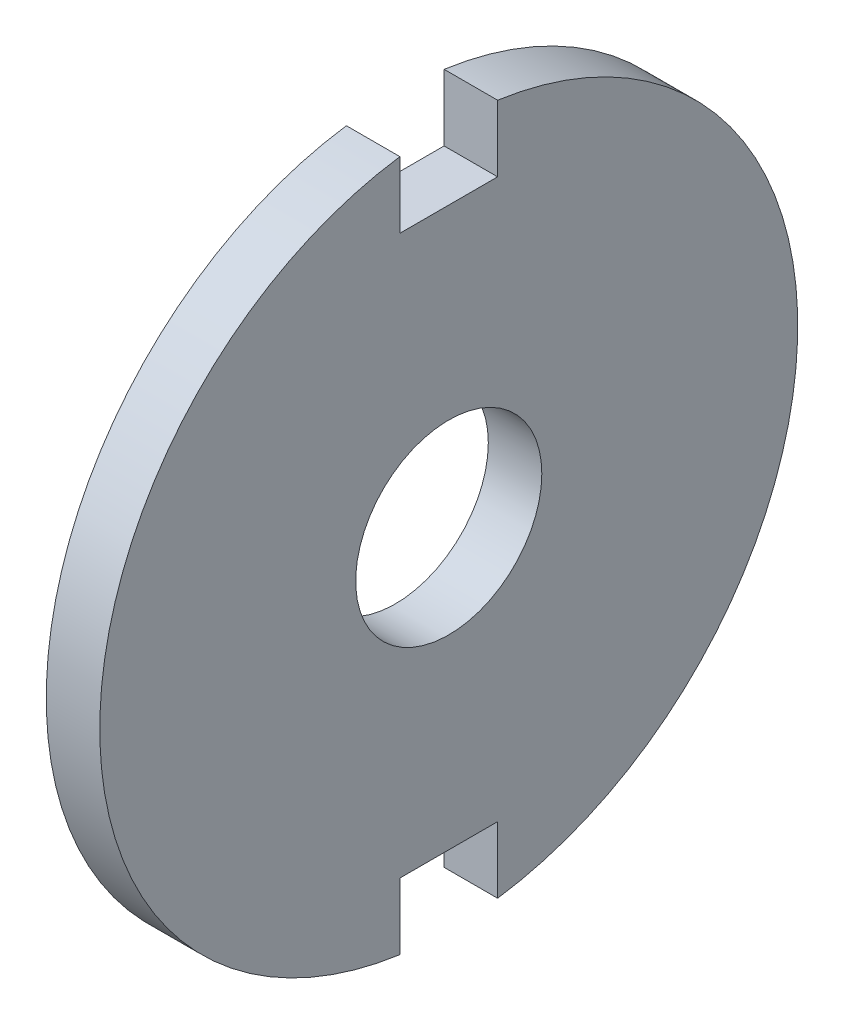
ISO-10303-21;
HEADER;
FILE_DESCRIPTION(('STEP AP214'),'2;1');
FILE_NAME('part.step','',(''),(''),'','','');
FILE_SCHEMA(('AUTOMOTIVE_DESIGN { 1 0 10303 214 1 1 1 1 }'));
ENDSEC;
DATA;
#1=APPLICATION_CONTEXT('core data for automotive mechanical design processes');
#2=APPLICATION_PROTOCOL_DEFINITION('international standard','automotive_design',2000,#1);
#3=PRODUCT_CONTEXT('',#1,'mechanical');
#4=PRODUCT('Part','Part','',(#3));
#5=PRODUCT_RELATED_PRODUCT_CATEGORY('part','',(#4));
#6=PRODUCT_DEFINITION_FORMATION('','',#4);
#7=PRODUCT_DEFINITION_CONTEXT('part definition',#1,'design');
#8=PRODUCT_DEFINITION('design','',#6,#7);
#9=PRODUCT_DEFINITION_SHAPE('','',#8);
#10=(LENGTH_UNIT() NAMED_UNIT(*) SI_UNIT(.MILLI.,.METRE.));
#11=(NAMED_UNIT(*) PLANE_ANGLE_UNIT() SI_UNIT($,.RADIAN.));
#12=(NAMED_UNIT(*) SI_UNIT($,.STERADIAN.) SOLID_ANGLE_UNIT());
#13=UNCERTAINTY_MEASURE_WITH_UNIT(LENGTH_MEASURE(1.E-05),#10,'distance_accuracy_value','');
#14=(GEOMETRIC_REPRESENTATION_CONTEXT(3) GLOBAL_UNCERTAINTY_ASSIGNED_CONTEXT((#13)) GLOBAL_UNIT_ASSIGNED_CONTEXT((#10,
#11,#12)) REPRESENTATION_CONTEXT('',''));
#15=CARTESIAN_POINT('',(0.,0.,0.));
#16=DIRECTION('',(0.,0.,1.));
#17=DIRECTION('',(1.,0.,0.));
#18=AXIS2_PLACEMENT_3D('',#15,#16,#17);
#19=CARTESIAN_POINT('',(123.45,0.,0.));
#20=DIRECTION('',(-1.,0.,0.));
#21=DIRECTION('',(0.,0.,1.));
#22=AXIS2_PLACEMENT_3D('',#19,#20,#21);
#23=CYLINDRICAL_SURFACE('',#22,4.);
#24=CARTESIAN_POINT('',(124.6,0.,0.));
#25=DIRECTION('',(-1.,0.,0.));
#26=DIRECTION('',(0.,0.,-1.));
#27=AXIS2_PLACEMENT_3D('',#24,#25,#26);
#28=CIRCLE('',#27,4.);
#29=CARTESIAN_POINT('',(124.6,0.,-4.));
#30=VERTEX_POINT('',#29);
#31=EDGE_CURVE('E42',#30,#30,#28,.T.);
#32=ORIENTED_EDGE('',*,*,#31,.F.);
#33=DIRECTION('',(-1.,0.,0.));
#34=VECTOR('',#33,1.);
#35=CARTESIAN_POINT('',(123.45,0.,-4.));
#36=LINE('',#35,#34);
#37=CARTESIAN_POINT('',(122.3,0.,-4.));
#38=VERTEX_POINT('',#37);
#39=EDGE_CURVE('E11',#30,#38,#36,.T.);
#40=ORIENTED_EDGE('',*,*,#39,.T.);
#41=CARTESIAN_POINT('',(122.3,0.,0.));
#42=DIRECTION('',(1.,0.,0.));
#43=DIRECTION('',(0.,0.,-1.));
#44=AXIS2_PLACEMENT_3D('',#41,#42,#43);
#45=CIRCLE('',#44,4.);
#46=EDGE_CURVE('E208',#38,#38,#45,.T.);
#47=ORIENTED_EDGE('',*,*,#46,.F.);
#48=ORIENTED_EDGE('',*,*,#39,.F.);
#49=EDGE_LOOP('',(#32,#40,#47,#48));
#50=FACE_BOUND('',#49,.T.);
#51=ADVANCED_FACE('F18',(#50),#23,.F.);
#52=CARTESIAN_POINT('',(122.3,0.,9.5));
#53=DIRECTION('',(-1.,0.,0.));
#54=DIRECTION('',(0.,0.,1.));
#55=AXIS2_PLACEMENT_3D('',#52,#53,#54);
#56=PLANE('',#55);
#57=DIRECTION('',(0.,-1.,0.));
#58=VECTOR('',#57,1.);
#59=CARTESIAN_POINT('',(122.3,-12.,-2.1));
#60=LINE('',#59,#58);
#61=CARTESIAN_POINT('',(122.3,-12.,-2.1));
#62=VERTEX_POINT('',#61);
#63=CARTESIAN_POINT('',(122.3,-14.85227255338,-2.1));
#64=VERTEX_POINT('',#63);
#65=EDGE_CURVE('E99',#62,#64,#60,.T.);
#66=ORIENTED_EDGE('',*,*,#65,.F.);
#67=DIRECTION('',(0.,0.,-1.));
#68=VECTOR('',#67,1.);
#69=CARTESIAN_POINT('',(122.3,-12.,2.1));
#70=LINE('',#69,#68);
#71=CARTESIAN_POINT('',(122.3,-12.,2.1));
#72=VERTEX_POINT('',#71);
#73=EDGE_CURVE('E175',#72,#62,#70,.T.);
#74=ORIENTED_EDGE('',*,*,#73,.F.);
#75=DIRECTION('',(0.,1.,0.));
#76=VECTOR('',#75,1.);
#77=CARTESIAN_POINT('',(122.3,-14.85227255338,2.1));
#78=LINE('',#77,#76);
#79=CARTESIAN_POINT('',(122.3,-14.85227255338,2.1));
#80=VERTEX_POINT('',#79);
#81=EDGE_CURVE('E182',#80,#72,#78,.T.);
#82=ORIENTED_EDGE('',*,*,#81,.F.);
#83=CARTESIAN_POINT('',(122.3,0.,0.));
#84=DIRECTION('',(-1.,0.,0.));
#85=DIRECTION('',(0.,0.,1.));
#86=AXIS2_PLACEMENT_3D('',#83,#84,#85);
#87=CIRCLE('',#86,15.);
#88=CARTESIAN_POINT('',(122.3,14.85227255338,2.1));
#89=VERTEX_POINT('',#88);
#90=EDGE_CURVE('E29',#80,#89,#87,.T.);
#91=ORIENTED_EDGE('',*,*,#90,.T.);
#92=DIRECTION('',(0.,1.,0.));
#93=VECTOR('',#92,1.);
#94=CARTESIAN_POINT('',(122.3,12.,2.1));
#95=LINE('',#94,#93);
#96=CARTESIAN_POINT('',(122.3,12.,2.1));
#97=VERTEX_POINT('',#96);
#98=EDGE_CURVE('E165',#97,#89,#95,.T.);
#99=ORIENTED_EDGE('',*,*,#98,.F.);
#100=DIRECTION('',(0.,0.,1.));
#101=VECTOR('',#100,1.);
#102=CARTESIAN_POINT('',(122.3,12.,-2.1));
#103=LINE('',#102,#101);
#104=CARTESIAN_POINT('',(122.3,12.,-2.1));
#105=VERTEX_POINT('',#104);
#106=EDGE_CURVE('E162',#105,#97,#103,.T.);
#107=ORIENTED_EDGE('',*,*,#106,.F.);
#108=DIRECTION('',(0.,-1.,0.));
#109=VECTOR('',#108,1.);
#110=CARTESIAN_POINT('',(122.3,14.85227255338,-2.1));
#111=LINE('',#110,#109);
#112=CARTESIAN_POINT('',(122.3,14.85227255338,-2.1));
#113=VERTEX_POINT('',#112);
#114=EDGE_CURVE('E154',#113,#105,#111,.T.);
#115=ORIENTED_EDGE('',*,*,#114,.F.);
#116=CARTESIAN_POINT('',(122.3,0.,0.));
#117=DIRECTION('',(-1.,0.,0.));
#118=DIRECTION('',(0.,0.,-1.));
#119=AXIS2_PLACEMENT_3D('',#116,#117,#118);
#120=CIRCLE('',#119,15.);
#121=EDGE_CURVE('E137',#113,#64,#120,.T.);
#122=ORIENTED_EDGE('',*,*,#121,.T.);
#123=EDGE_LOOP('',(#66,#74,#82,#91,#99,#107,#115,#122));
#124=FACE_BOUND('',#123,.T.);
#125=ORIENTED_EDGE('',*,*,#46,.T.);
#126=EDGE_LOOP('',(#125));
#127=FACE_BOUND('',#126,.T.);
#128=ADVANCED_FACE('F227',(#124,#127),#56,.T.);
#129=CARTESIAN_POINT('',(123.45,-16.,-2.1));
#130=DIRECTION('',(0.,0.,-1.));
#131=DIRECTION('',(0.,-1.,0.));
#132=AXIS2_PLACEMENT_3D('',#129,#130,#131);
#133=PLANE('',#132);
#134=DIRECTION('',(-1.,0.,0.));
#135=VECTOR('',#134,1.);
#136=CARTESIAN_POINT('',(124.6,-14.85227255338,-2.1));
#137=LINE('',#136,#135);
#138=CARTESIAN_POINT('',(124.6,-14.85227255338,-2.1));
#139=VERTEX_POINT('',#138);
#140=EDGE_CURVE('E109',#139,#64,#137,.T.);
#141=ORIENTED_EDGE('',*,*,#140,.F.);
#142=DIRECTION('',(0.,1.,0.));
#143=VECTOR('',#142,1.);
#144=CARTESIAN_POINT('',(124.6,-14.85227255338,-2.1));
#145=LINE('',#144,#143);
#146=CARTESIAN_POINT('',(124.6,-12.,-2.1));
#147=VERTEX_POINT('',#146);
#148=EDGE_CURVE('E129',#139,#147,#145,.T.);
#149=ORIENTED_EDGE('',*,*,#148,.T.);
#150=DIRECTION('',(-1.,0.,0.));
#151=VECTOR('',#150,1.);
#152=CARTESIAN_POINT('',(124.6,-12.,-2.1));
#153=LINE('',#152,#151);
#154=EDGE_CURVE('E250',#147,#62,#153,.T.);
#155=ORIENTED_EDGE('',*,*,#154,.T.);
#156=ORIENTED_EDGE('',*,*,#65,.T.);
#157=EDGE_LOOP('',(#141,#149,#155,#156));
#158=FACE_BOUND('',#157,.T.);
#159=ADVANCED_FACE('F260',(#158),#133,.F.);
#160=CARTESIAN_POINT('',(123.45,0.,0.));
#161=DIRECTION('',(-1.,0.,0.));
#162=DIRECTION('',(0.,0.,-1.));
#163=AXIS2_PLACEMENT_3D('',#160,#161,#162);
#164=CYLINDRICAL_SURFACE('',#163,15.);
#165=CARTESIAN_POINT('',(124.6,0.,0.));
#166=DIRECTION('',(1.,0.,0.));
#167=DIRECTION('',(0.,-0.990151503558925,-0.140000000000003));
#168=AXIS2_PLACEMENT_3D('',#165,#166,#167);
#169=CIRCLE('',#168,15.);
#170=CARTESIAN_POINT('',(124.6,14.85227255338,-2.1));
#171=VERTEX_POINT('',#170);
#172=EDGE_CURVE('E120',#139,#171,#169,.T.);
#173=ORIENTED_EDGE('',*,*,#172,.F.);
#174=ORIENTED_EDGE('',*,*,#140,.T.);
#175=ORIENTED_EDGE('',*,*,#121,.F.);
#176=DIRECTION('',(1.,0.,0.));
#177=VECTOR('',#176,1.);
#178=CARTESIAN_POINT('',(122.3,14.85227255338,-2.1));
#179=LINE('',#178,#177);
#180=EDGE_CURVE('E132',#113,#171,#179,.T.);
#181=ORIENTED_EDGE('',*,*,#180,.T.);
#182=EDGE_LOOP('',(#173,#174,#175,#181));
#183=FACE_BOUND('',#182,.T.);
#184=ADVANCED_FACE('F136',(#183),#164,.T.);
#185=CARTESIAN_POINT('',(124.6,0.,9.5));
#186=DIRECTION('',(1.,0.,0.));
#187=DIRECTION('',(0.,1.,0.));
#188=AXIS2_PLACEMENT_3D('',#185,#186,#187);
#189=PLANE('',#188);
#190=ORIENTED_EDGE('',*,*,#148,.F.);
#191=ORIENTED_EDGE('',*,*,#172,.T.);
#192=DIRECTION('',(0.,1.,0.));
#193=VECTOR('',#192,1.);
#194=CARTESIAN_POINT('',(124.6,12.,-2.1));
#195=LINE('',#194,#193);
#196=CARTESIAN_POINT('',(124.6,12.,-2.1));
#197=VERTEX_POINT('',#196);
#198=EDGE_CURVE('E126',#197,#171,#195,.T.);
#199=ORIENTED_EDGE('',*,*,#198,.F.);
#200=DIRECTION('',(0.,0.,-1.));
#201=VECTOR('',#200,1.);
#202=CARTESIAN_POINT('',(124.6,12.,2.1));
#203=LINE('',#202,#201);
#204=CARTESIAN_POINT('',(124.6,12.,2.1));
#205=VERTEX_POINT('',#204);
#206=EDGE_CURVE('E166',#205,#197,#203,.T.);
#207=ORIENTED_EDGE('',*,*,#206,.F.);
#208=DIRECTION('',(0.,-1.,0.));
#209=VECTOR('',#208,1.);
#210=CARTESIAN_POINT('',(124.6,14.85227255338,2.1));
#211=LINE('',#210,#209);
#212=CARTESIAN_POINT('',(124.6,14.85227255338,2.1));
#213=VERTEX_POINT('',#212);
#214=EDGE_CURVE('E205',#213,#205,#211,.T.);
#215=ORIENTED_EDGE('',*,*,#214,.F.);
#216=CARTESIAN_POINT('',(124.6,0.,0.));
#217=DIRECTION('',(1.,0.,0.));
#218=DIRECTION('',(0.,0.,1.));
#219=AXIS2_PLACEMENT_3D('',#216,#217,#218);
#220=CIRCLE('',#219,15.);
#221=CARTESIAN_POINT('',(124.6,-14.85227255338,2.1));
#222=VERTEX_POINT('',#221);
#223=EDGE_CURVE('E22',#213,#222,#220,.T.);
#224=ORIENTED_EDGE('',*,*,#223,.T.);
#225=DIRECTION('',(0.,-1.,0.));
#226=VECTOR('',#225,1.);
#227=CARTESIAN_POINT('',(124.6,-12.,2.1));
#228=LINE('',#227,#226);
#229=CARTESIAN_POINT('',(124.6,-12.,2.1));
#230=VERTEX_POINT('',#229);
#231=EDGE_CURVE('E168',#230,#222,#228,.T.);
#232=ORIENTED_EDGE('',*,*,#231,.F.);
#233=DIRECTION('',(0.,0.,1.));
#234=VECTOR('',#233,1.);
#235=CARTESIAN_POINT('',(124.6,-12.,-2.1));
#236=LINE('',#235,#234);
#237=EDGE_CURVE('E184',#147,#230,#236,.T.);
#238=ORIENTED_EDGE('',*,*,#237,.F.);
#239=EDGE_LOOP('',(#190,#191,#199,#207,#215,#224,#232,#238));
#240=FACE_BOUND('',#239,.T.);
#241=ORIENTED_EDGE('',*,*,#31,.T.);
#242=EDGE_LOOP('',(#241));
#243=FACE_BOUND('',#242,.T.);
#244=ADVANCED_FACE('F122',(#240,#243),#189,.T.);
#245=CARTESIAN_POINT('',(123.45,-12.,0.));
#246=DIRECTION('',(0.,-1.,0.));
#247=DIRECTION('',(0.,0.,-1.));
#248=AXIS2_PLACEMENT_3D('',#245,#246,#247);
#249=PLANE('',#248);
#250=ORIENTED_EDGE('',*,*,#73,.T.);
#251=ORIENTED_EDGE('',*,*,#154,.F.);
#252=ORIENTED_EDGE('',*,*,#237,.T.);
#253=DIRECTION('',(1.,0.,0.));
#254=VECTOR('',#253,1.);
#255=CARTESIAN_POINT('',(122.3,-12.,2.1));
#256=LINE('',#255,#254);
#257=EDGE_CURVE('E172',#72,#230,#256,.T.);
#258=ORIENTED_EDGE('',*,*,#257,.F.);
#259=EDGE_LOOP('',(#250,#251,#252,#258));
#260=FACE_BOUND('',#259,.T.);
#261=ADVANCED_FACE('F258',(#260),#249,.T.);
#262=CARTESIAN_POINT('',(123.45,-16.,2.1));
#263=DIRECTION('',(0.,0.,-1.));
#264=DIRECTION('',(0.,-1.,0.));
#265=AXIS2_PLACEMENT_3D('',#262,#263,#264);
#266=PLANE('',#265);
#267=DIRECTION('',(1.,0.,0.));
#268=VECTOR('',#267,1.);
#269=CARTESIAN_POINT('',(122.3,-14.85227255338,2.1));
#270=LINE('',#269,#268);
#271=EDGE_CURVE('E173',#80,#222,#270,.T.);
#272=ORIENTED_EDGE('',*,*,#271,.F.);
#273=ORIENTED_EDGE('',*,*,#81,.T.);
#274=ORIENTED_EDGE('',*,*,#257,.T.);
#275=ORIENTED_EDGE('',*,*,#231,.T.);
#276=EDGE_LOOP('',(#272,#273,#274,#275));
#277=FACE_BOUND('',#276,.T.);
#278=ADVANCED_FACE('F315',(#277),#266,.T.);
#279=CARTESIAN_POINT('',(123.45,0.,0.));
#280=DIRECTION('',(-1.,0.,0.));
#281=DIRECTION('',(0.,0.,1.));
#282=AXIS2_PLACEMENT_3D('',#279,#280,#281);
#283=CYLINDRICAL_SURFACE('',#282,15.);
#284=ORIENTED_EDGE('',*,*,#90,.F.);
#285=ORIENTED_EDGE('',*,*,#271,.T.);
#286=ORIENTED_EDGE('',*,*,#223,.F.);
#287=DIRECTION('',(-1.,0.,0.));
#288=VECTOR('',#287,1.);
#289=CARTESIAN_POINT('',(124.6,14.85227255338,2.1));
#290=LINE('',#289,#288);
#291=EDGE_CURVE('E222',#213,#89,#290,.T.);
#292=ORIENTED_EDGE('',*,*,#291,.T.);
#293=EDGE_LOOP('',(#284,#285,#286,#292));
#294=FACE_BOUND('',#293,.T.);
#295=ADVANCED_FACE('F234',(#294),#283,.T.);
#296=CARTESIAN_POINT('',(123.45,16.,2.1));
#297=DIRECTION('',(0.,0.,1.));
#298=DIRECTION('',(1.,0.,0.));
#299=AXIS2_PLACEMENT_3D('',#296,#297,#298);
#300=PLANE('',#299);
#301=ORIENTED_EDGE('',*,*,#291,.F.);
#302=ORIENTED_EDGE('',*,*,#214,.T.);
#303=DIRECTION('',(-1.,0.,0.));
#304=VECTOR('',#303,1.);
#305=CARTESIAN_POINT('',(124.6,12.,2.1));
#306=LINE('',#305,#304);
#307=EDGE_CURVE('E201',#205,#97,#306,.T.);
#308=ORIENTED_EDGE('',*,*,#307,.T.);
#309=ORIENTED_EDGE('',*,*,#98,.T.);
#310=EDGE_LOOP('',(#301,#302,#308,#309));
#311=FACE_BOUND('',#310,.T.);
#312=ADVANCED_FACE('F20',(#311),#300,.F.);
#313=CARTESIAN_POINT('',(123.45,12.,0.));
#314=DIRECTION('',(0.,1.,0.));
#315=DIRECTION('',(1.,0.,0.));
#316=AXIS2_PLACEMENT_3D('',#313,#314,#315);
#317=PLANE('',#316);
#318=ORIENTED_EDGE('',*,*,#106,.T.);
#319=ORIENTED_EDGE('',*,*,#307,.F.);
#320=ORIENTED_EDGE('',*,*,#206,.T.);
#321=DIRECTION('',(1.,0.,0.));
#322=VECTOR('',#321,1.);
#323=CARTESIAN_POINT('',(122.3,12.,-2.1));
#324=LINE('',#323,#322);
#325=EDGE_CURVE('E145',#105,#197,#324,.T.);
#326=ORIENTED_EDGE('',*,*,#325,.F.);
#327=EDGE_LOOP('',(#318,#319,#320,#326));
#328=FACE_BOUND('',#327,.T.);
#329=ADVANCED_FACE('F389',(#328),#317,.T.);
#330=CARTESIAN_POINT('',(123.45,16.,-2.1));
#331=DIRECTION('',(0.,0.,1.));
#332=DIRECTION('',(1.,0.,0.));
#333=AXIS2_PLACEMENT_3D('',#330,#331,#332);
#334=PLANE('',#333);
#335=ORIENTED_EDGE('',*,*,#180,.F.);
#336=ORIENTED_EDGE('',*,*,#114,.T.);
#337=ORIENTED_EDGE('',*,*,#325,.T.);
#338=ORIENTED_EDGE('',*,*,#198,.T.);
#339=EDGE_LOOP('',(#335,#336,#337,#338));
#340=FACE_BOUND('',#339,.T.);
#341=ADVANCED_FACE('F143',(#340),#334,.T.);
#342=CLOSED_SHELL('',(#51,#128,#159,#184,#244,#261,#278,#295,#312,#329,#341));
#343=CARTESIAN_POINT('',(123.05,0.,0.));
#344=DIRECTION('',(1.,0.,0.));
#345=DIRECTION('',(0.,0.,-1.));
#346=AXIS2_PLACEMENT_3D('',#343,#344,#345);
#347=CYLINDRICAL_SURFACE('',#346,6.5);
#348=DIRECTION('',(1.,0.,0.));
#349=VECTOR('',#348,1.);
#350=CARTESIAN_POINT('',(123.05,0.,6.5));
#351=LINE('',#350,#349);
#352=CARTESIAN_POINT('',(122.9,0.,6.5));
#353=VERTEX_POINT('',#352);
#354=CARTESIAN_POINT('',(123.2,0.,6.5));
#355=VERTEX_POINT('',#354);
#356=EDGE_CURVE('E180',#353,#355,#351,.T.);
#357=ORIENTED_EDGE('',*,*,#356,.F.);
#358=CARTESIAN_POINT('',(122.9,0.,0.));
#359=DIRECTION('',(1.,0.,0.));
#360=DIRECTION('',(0.,0.,-1.));
#361=AXIS2_PLACEMENT_3D('',#358,#359,#360);
#362=CIRCLE('',#361,6.5);
#363=EDGE_CURVE('E181',#353,#353,#362,.T.);
#364=ORIENTED_EDGE('',*,*,#363,.F.);
#365=ORIENTED_EDGE('',*,*,#356,.T.);
#366=CARTESIAN_POINT('',(123.2,0.,0.));
#367=DIRECTION('',(-1.,0.,0.));
#368=DIRECTION('',(0.,0.,-1.));
#369=AXIS2_PLACEMENT_3D('',#366,#367,#368);
#370=CIRCLE('',#369,6.5);
#371=EDGE_CURVE('E177',#355,#355,#370,.T.);
#372=ORIENTED_EDGE('',*,*,#371,.F.);
#373=EDGE_LOOP('',(#357,#364,#365,#372));
#374=FACE_BOUND('',#373,.T.);
#375=ADVANCED_FACE('F276',(#374),#347,.F.);
#376=CARTESIAN_POINT('',(123.2,0.,-6.35));
#377=DIRECTION('',(1.,0.,0.));
#378=DIRECTION('',(0.,1.,0.));
#379=AXIS2_PLACEMENT_3D('',#376,#377,#378);
#380=PLANE('',#379);
#381=ORIENTED_EDGE('',*,*,#371,.T.);
#382=EDGE_LOOP('',(#381));
#383=FACE_BOUND('',#382,.T.);
#384=CARTESIAN_POINT('',(123.2,0.,0.));
#385=DIRECTION('',(1.,0.,0.));
#386=DIRECTION('',(0.,0.,1.));
#387=AXIS2_PLACEMENT_3D('',#384,#385,#386);
#388=CIRCLE('',#387,6.2);
#389=CARTESIAN_POINT('',(123.2,0.,6.2));
#390=VERTEX_POINT('',#389);
#391=EDGE_CURVE('E157',#390,#390,#388,.T.);
#392=ORIENTED_EDGE('',*,*,#391,.T.);
#393=EDGE_LOOP('',(#392));
#394=FACE_BOUND('',#393,.T.);
#395=ADVANCED_FACE('F279',(#383,#394),#380,.F.);
#396=CARTESIAN_POINT('',(123.05,0.,0.));
#397=DIRECTION('',(-1.,0.,0.));
#398=DIRECTION('',(0.,0.,-1.));
#399=AXIS2_PLACEMENT_3D('',#396,#397,#398);
#400=CONICAL_SURFACE('',#399,6.35,0.785398163397448);
#401=DIRECTION('',(0.707106781186548,0.,-0.707106781186548));
#402=VECTOR('',#401,1.);
#403=CARTESIAN_POINT('',(123.05,0.,6.35));
#404=LINE('',#403,#402);
#405=EDGE_CURVE('E147',#353,#390,#404,.T.);
#406=ORIENTED_EDGE('',*,*,#405,.F.);
#407=ORIENTED_EDGE('',*,*,#363,.T.);
#408=ORIENTED_EDGE('',*,*,#405,.T.);
#409=ORIENTED_EDGE('',*,*,#391,.F.);
#410=EDGE_LOOP('',(#406,#407,#408,#409));
#411=FACE_BOUND('',#410,.T.);
#412=ADVANCED_FACE('F273',(#411),#400,.T.);
#413=CLOSED_SHELL('',(#375,#395,#412));
#414=ORIENTED_CLOSED_SHELL('',*,#413,.T.);
#415=BREP_WITH_VOIDS('B1',#342,(#414));
#416=ADVANCED_BREP_SHAPE_REPRESENTATION('',(#18,#415),#14);
#417=SHAPE_DEFINITION_REPRESENTATION(#9,#416);
ENDSEC;
END-ISO-10303-21;
